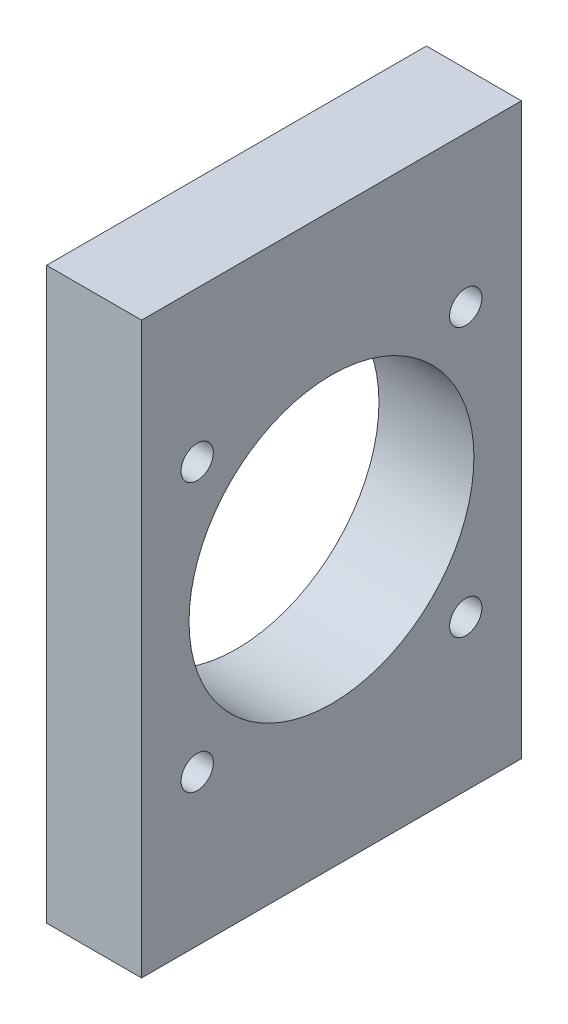
ISO-10303-21;
HEADER;
FILE_DESCRIPTION(('STEP AP214'),'2;1');
FILE_NAME('part.step','',(''),(''),'','','');
FILE_SCHEMA(('AUTOMOTIVE_DESIGN { 1 0 10303 214 1 1 1 1 }'));
ENDSEC;
DATA;
#1=APPLICATION_CONTEXT('core data for automotive mechanical design processes');
#2=APPLICATION_PROTOCOL_DEFINITION('international standard','automotive_design',2000,#1);
#3=PRODUCT_CONTEXT('',#1,'mechanical');
#4=PRODUCT('Part','Part','',(#3));
#5=PRODUCT_RELATED_PRODUCT_CATEGORY('part','',(#4));
#6=PRODUCT_DEFINITION_FORMATION('','',#4);
#7=PRODUCT_DEFINITION_CONTEXT('part definition',#1,'design');
#8=PRODUCT_DEFINITION('design','',#6,#7);
#9=PRODUCT_DEFINITION_SHAPE('','',#8);
#10=(LENGTH_UNIT() NAMED_UNIT(*) SI_UNIT(.MILLI.,.METRE.));
#11=(NAMED_UNIT(*) PLANE_ANGLE_UNIT() SI_UNIT($,.RADIAN.));
#12=(NAMED_UNIT(*) SI_UNIT($,.STERADIAN.) SOLID_ANGLE_UNIT());
#13=UNCERTAINTY_MEASURE_WITH_UNIT(LENGTH_MEASURE(1.E-05),#10,'distance_accuracy_value','');
#14=(GEOMETRIC_REPRESENTATION_CONTEXT(3) GLOBAL_UNCERTAINTY_ASSIGNED_CONTEXT((#13)) GLOBAL_UNIT_ASSIGNED_CONTEXT((#10,
#11,#12)) REPRESENTATION_CONTEXT('',''));
#15=CARTESIAN_POINT('',(0.,0.,0.));
#16=DIRECTION('',(0.,0.,1.));
#17=DIRECTION('',(1.,0.,0.));
#18=AXIS2_PLACEMENT_3D('',#15,#16,#17);
#19=CARTESIAN_POINT('',(10.,0.,0.));
#20=DIRECTION('',(0.,0.,-1.));
#21=DIRECTION('',(-1.,0.,0.));
#22=AXIS2_PLACEMENT_3D('',#19,#20,#21);
#23=PLANE('',#22);
#24=DIRECTION('',(0.,-1.,0.));
#25=VECTOR('',#24,1.);
#26=CARTESIAN_POINT('',(0.,0.,0.));
#27=LINE('',#26,#25);
#28=CARTESIAN_POINT('',(0.,60.,0.));
#29=VERTEX_POINT('',#28);
#30=CARTESIAN_POINT('',(0.,0.,0.));
#31=VERTEX_POINT('',#30);
#32=EDGE_CURVE('E112',#29,#31,#27,.T.);
#33=ORIENTED_EDGE('',*,*,#32,.T.);
#34=DIRECTION('',(-1.,0.,0.));
#35=VECTOR('',#34,1.);
#36=CARTESIAN_POINT('',(10.,0.,0.));
#37=LINE('',#36,#35);
#38=CARTESIAN_POINT('',(10.,0.,0.));
#39=VERTEX_POINT('',#38);
#40=EDGE_CURVE('E11',#39,#31,#37,.T.);
#41=ORIENTED_EDGE('',*,*,#40,.F.);
#42=DIRECTION('',(0.,-1.,0.));
#43=VECTOR('',#42,1.);
#44=CARTESIAN_POINT('',(10.,0.,0.));
#45=LINE('',#44,#43);
#46=CARTESIAN_POINT('',(10.,60.,0.));
#47=VERTEX_POINT('',#46);
#48=EDGE_CURVE('E96',#47,#39,#45,.T.);
#49=ORIENTED_EDGE('',*,*,#48,.F.);
#50=DIRECTION('',(-1.,0.,0.));
#51=VECTOR('',#50,1.);
#52=CARTESIAN_POINT('',(10.,60.,0.));
#53=LINE('',#52,#51);
#54=EDGE_CURVE('E108',#47,#29,#53,.T.);
#55=ORIENTED_EDGE('',*,*,#54,.T.);
#56=EDGE_LOOP('',(#33,#41,#49,#55));
#57=FACE_BOUND('',#56,.T.);
#58=ADVANCED_FACE('F44',(#57),#23,.F.);
#59=CARTESIAN_POINT('',(10.,0.,0.));
#60=DIRECTION('',(0.,1.,0.));
#61=DIRECTION('',(0.,0.,1.));
#62=AXIS2_PLACEMENT_3D('',#59,#60,#61);
#63=PLANE('',#62);
#64=DIRECTION('',(0.,0.,-1.));
#65=VECTOR('',#64,1.);
#66=CARTESIAN_POINT('',(0.,0.,0.));
#67=LINE('',#66,#65);
#68=CARTESIAN_POINT('',(0.,0.,-40.));
#69=VERTEX_POINT('',#68);
#70=EDGE_CURVE('E101',#31,#69,#67,.T.);
#71=ORIENTED_EDGE('',*,*,#70,.T.);
#72=DIRECTION('',(-1.,0.,0.));
#73=VECTOR('',#72,1.);
#74=CARTESIAN_POINT('',(10.,0.,-40.));
#75=LINE('',#74,#73);
#76=CARTESIAN_POINT('',(10.,0.,-40.));
#77=VERTEX_POINT('',#76);
#78=EDGE_CURVE('E53',#77,#69,#75,.T.);
#79=ORIENTED_EDGE('',*,*,#78,.F.);
#80=DIRECTION('',(0.,0.,-1.));
#81=VECTOR('',#80,1.);
#82=CARTESIAN_POINT('',(10.,0.,0.));
#83=LINE('',#82,#81);
#84=EDGE_CURVE('E91',#39,#77,#83,.T.);
#85=ORIENTED_EDGE('',*,*,#84,.F.);
#86=ORIENTED_EDGE('',*,*,#40,.T.);
#87=EDGE_LOOP('',(#71,#79,#85,#86));
#88=FACE_BOUND('',#87,.T.);
#89=ADVANCED_FACE('F100',(#88),#63,.F.);
#90=CARTESIAN_POINT('',(10.,0.,-40.));
#91=DIRECTION('',(0.,0.,1.));
#92=DIRECTION('',(1.,0.,0.));
#93=AXIS2_PLACEMENT_3D('',#90,#91,#92);
#94=PLANE('',#93);
#95=DIRECTION('',(0.,1.,0.));
#96=VECTOR('',#95,1.);
#97=CARTESIAN_POINT('',(0.,0.,-40.));
#98=LINE('',#97,#96);
#99=CARTESIAN_POINT('',(0.,60.,-40.));
#100=VERTEX_POINT('',#99);
#101=EDGE_CURVE('E78',#69,#100,#98,.T.);
#102=ORIENTED_EDGE('',*,*,#101,.T.);
#103=DIRECTION('',(-1.,0.,0.));
#104=VECTOR('',#103,1.);
#105=CARTESIAN_POINT('',(10.,60.,-40.));
#106=LINE('',#105,#104);
#107=CARTESIAN_POINT('',(10.,60.,-40.));
#108=VERTEX_POINT('',#107);
#109=EDGE_CURVE('E103',#108,#100,#106,.T.);
#110=ORIENTED_EDGE('',*,*,#109,.F.);
#111=DIRECTION('',(0.,1.,0.));
#112=VECTOR('',#111,1.);
#113=CARTESIAN_POINT('',(10.,0.,-40.));
#114=LINE('',#113,#112);
#115=EDGE_CURVE('E94',#77,#108,#114,.T.);
#116=ORIENTED_EDGE('',*,*,#115,.F.);
#117=ORIENTED_EDGE('',*,*,#78,.T.);
#118=EDGE_LOOP('',(#102,#110,#116,#117));
#119=FACE_BOUND('',#118,.T.);
#120=ADVANCED_FACE('F104',(#119),#94,.F.);
#121=CARTESIAN_POINT('',(10.,60.,0.));
#122=DIRECTION('',(0.,-1.,0.));
#123=DIRECTION('',(0.,0.,-1.));
#124=AXIS2_PLACEMENT_3D('',#121,#122,#123);
#125=PLANE('',#124);
#126=DIRECTION('',(0.,0.,1.));
#127=VECTOR('',#126,1.);
#128=CARTESIAN_POINT('',(0.,60.,0.));
#129=LINE('',#128,#127);
#130=EDGE_CURVE('E84',#100,#29,#129,.T.);
#131=ORIENTED_EDGE('',*,*,#130,.T.);
#132=ORIENTED_EDGE('',*,*,#54,.F.);
#133=DIRECTION('',(0.,0.,1.));
#134=VECTOR('',#133,1.);
#135=CARTESIAN_POINT('',(10.,60.,0.));
#136=LINE('',#135,#134);
#137=EDGE_CURVE('E61',#108,#47,#136,.T.);
#138=ORIENTED_EDGE('',*,*,#137,.F.);
#139=ORIENTED_EDGE('',*,*,#109,.T.);
#140=EDGE_LOOP('',(#131,#132,#138,#139));
#141=FACE_BOUND('',#140,.T.);
#142=ADVANCED_FACE('F126',(#141),#125,.F.);
#143=CARTESIAN_POINT('',(10.,0.,0.));
#144=DIRECTION('',(-1.,0.,0.));
#145=DIRECTION('',(0.,0.,1.));
#146=AXIS2_PLACEMENT_3D('',#143,#144,#145);
#147=PLANE('',#146);
#148=CARTESIAN_POINT('',(10.,30.,-20.));
#149=DIRECTION('',(-1.,0.,0.));
#150=DIRECTION('',(0.,0.,1.));
#151=AXIS2_PLACEMENT_3D('',#148,#149,#150);
#152=CIRCLE('',#151,15.);
#153=CARTESIAN_POINT('',(10.,30.,-5.));
#154=VERTEX_POINT('',#153);
#155=EDGE_CURVE('E196',#154,#154,#152,.T.);
#156=ORIENTED_EDGE('',*,*,#155,.T.);
#157=EDGE_LOOP('',(#156));
#158=FACE_BOUND('',#157,.T.);
#159=CARTESIAN_POINT('',(10.,44.1421356237309,-5.85786437626904));
#160=DIRECTION('',(-1.,0.,0.));
#161=DIRECTION('',(0.,0.,1.));
#162=AXIS2_PLACEMENT_3D('',#159,#160,#161);
#163=CIRCLE('',#162,1.7);
#164=CARTESIAN_POINT('',(10.,44.1421356237309,-4.15786437626904));
#165=VERTEX_POINT('',#164);
#166=EDGE_CURVE('E180',#165,#165,#163,.T.);
#167=ORIENTED_EDGE('',*,*,#166,.T.);
#168=EDGE_LOOP('',(#167));
#169=FACE_BOUND('',#168,.T.);
#170=CARTESIAN_POINT('',(10.,44.142135623731,-34.1421356237309));
#171=DIRECTION('',(-1.,0.,0.));
#172=DIRECTION('',(0.,0.,1.));
#173=AXIS2_PLACEMENT_3D('',#170,#171,#172);
#174=CIRCLE('',#173,1.7);
#175=CARTESIAN_POINT('',(10.,44.142135623731,-32.4421356237309));
#176=VERTEX_POINT('',#175);
#177=EDGE_CURVE('E164',#176,#176,#174,.T.);
#178=ORIENTED_EDGE('',*,*,#177,.T.);
#179=EDGE_LOOP('',(#178));
#180=FACE_BOUND('',#179,.T.);
#181=CARTESIAN_POINT('',(10.,15.8578643762691,-34.142135623731));
#182=DIRECTION('',(-1.,0.,0.));
#183=DIRECTION('',(0.,0.,1.));
#184=AXIS2_PLACEMENT_3D('',#181,#182,#183);
#185=CIRCLE('',#184,1.7);
#186=CARTESIAN_POINT('',(10.,15.8578643762691,-32.442135623731));
#187=VERTEX_POINT('',#186);
#188=EDGE_CURVE('E148',#187,#187,#185,.T.);
#189=ORIENTED_EDGE('',*,*,#188,.T.);
#190=EDGE_LOOP('',(#189));
#191=FACE_BOUND('',#190,.T.);
#192=CARTESIAN_POINT('',(10.,15.8578643762691,-5.85786437626905));
#193=DIRECTION('',(-1.,0.,0.));
#194=DIRECTION('',(0.,0.,1.));
#195=AXIS2_PLACEMENT_3D('',#192,#193,#194);
#196=CIRCLE('',#195,1.7);
#197=CARTESIAN_POINT('',(10.,15.8578643762691,-4.15786437626905));
#198=VERTEX_POINT('',#197);
#199=EDGE_CURVE('E116',#198,#198,#196,.T.);
#200=ORIENTED_EDGE('',*,*,#199,.T.);
#201=EDGE_LOOP('',(#200));
#202=FACE_BOUND('',#201,.T.);
#203=ORIENTED_EDGE('',*,*,#48,.T.);
#204=ORIENTED_EDGE('',*,*,#84,.T.);
#205=ORIENTED_EDGE('',*,*,#115,.T.);
#206=ORIENTED_EDGE('',*,*,#137,.T.);
#207=EDGE_LOOP('',(#203,#204,#205,#206));
#208=FACE_BOUND('',#207,.T.);
#209=ADVANCED_FACE('F92',(#158,#169,#180,#191,#202,#208),#147,.F.);
#210=CARTESIAN_POINT('',(0.,0.,0.));
#211=DIRECTION('',(-1.,0.,0.));
#212=DIRECTION('',(0.,0.,1.));
#213=AXIS2_PLACEMENT_3D('',#210,#211,#212);
#214=PLANE('',#213);
#215=CARTESIAN_POINT('',(0.,30.,-20.));
#216=DIRECTION('',(-1.,0.,0.));
#217=DIRECTION('',(0.,0.,1.));
#218=AXIS2_PLACEMENT_3D('',#215,#216,#217);
#219=CIRCLE('',#218,15.);
#220=CARTESIAN_POINT('',(0.,30.,-5.));
#221=VERTEX_POINT('',#220);
#222=EDGE_CURVE('E197',#221,#221,#219,.T.);
#223=ORIENTED_EDGE('',*,*,#222,.F.);
#224=EDGE_LOOP('',(#223));
#225=FACE_BOUND('',#224,.T.);
#226=CARTESIAN_POINT('',(0.,44.1421356237309,-5.85786437626904));
#227=DIRECTION('',(-1.,0.,0.));
#228=DIRECTION('',(0.,0.,1.));
#229=AXIS2_PLACEMENT_3D('',#226,#227,#228);
#230=CIRCLE('',#229,3.25);
#231=CARTESIAN_POINT('',(0.,44.1421356237309,-2.60786437626904));
#232=VERTEX_POINT('',#231);
#233=EDGE_CURVE('E192',#232,#232,#230,.T.);
#234=ORIENTED_EDGE('',*,*,#233,.F.);
#235=EDGE_LOOP('',(#234));
#236=FACE_BOUND('',#235,.T.);
#237=CARTESIAN_POINT('',(0.,44.142135623731,-34.1421356237309));
#238=DIRECTION('',(-1.,0.,0.));
#239=DIRECTION('',(0.,0.,1.));
#240=AXIS2_PLACEMENT_3D('',#237,#238,#239);
#241=CIRCLE('',#240,3.25);
#242=CARTESIAN_POINT('',(0.,44.142135623731,-30.8921356237309));
#243=VERTEX_POINT('',#242);
#244=EDGE_CURVE('E176',#243,#243,#241,.T.);
#245=ORIENTED_EDGE('',*,*,#244,.F.);
#246=EDGE_LOOP('',(#245));
#247=FACE_BOUND('',#246,.T.);
#248=CARTESIAN_POINT('',(0.,15.8578643762691,-34.142135623731));
#249=DIRECTION('',(-1.,0.,0.));
#250=DIRECTION('',(0.,0.,1.));
#251=AXIS2_PLACEMENT_3D('',#248,#249,#250);
#252=CIRCLE('',#251,3.25);
#253=CARTESIAN_POINT('',(0.,15.8578643762691,-30.892135623731));
#254=VERTEX_POINT('',#253);
#255=EDGE_CURVE('E160',#254,#254,#252,.T.);
#256=ORIENTED_EDGE('',*,*,#255,.F.);
#257=EDGE_LOOP('',(#256));
#258=FACE_BOUND('',#257,.T.);
#259=CARTESIAN_POINT('',(0.,15.8578643762691,-5.85786437626905));
#260=DIRECTION('',(-1.,0.,0.));
#261=DIRECTION('',(0.,0.,1.));
#262=AXIS2_PLACEMENT_3D('',#259,#260,#261);
#263=CIRCLE('',#262,3.25);
#264=CARTESIAN_POINT('',(0.,15.8578643762691,-2.60786437626905));
#265=VERTEX_POINT('',#264);
#266=EDGE_CURVE('E144',#265,#265,#263,.T.);
#267=ORIENTED_EDGE('',*,*,#266,.F.);
#268=EDGE_LOOP('',(#267));
#269=FACE_BOUND('',#268,.T.);
#270=ORIENTED_EDGE('',*,*,#32,.F.);
#271=ORIENTED_EDGE('',*,*,#130,.F.);
#272=ORIENTED_EDGE('',*,*,#101,.F.);
#273=ORIENTED_EDGE('',*,*,#70,.F.);
#274=EDGE_LOOP('',(#270,#271,#272,#273));
#275=FACE_BOUND('',#274,.T.);
#276=ADVANCED_FACE('F129',(#225,#236,#247,#258,#269,#275),#214,.T.);
#277=CARTESIAN_POINT('',(0.,15.8578643762691,-5.85786437626905));
#278=DIRECTION('',(-1.,0.,0.));
#279=DIRECTION('',(0.,0.,1.));
#280=AXIS2_PLACEMENT_3D('',#277,#278,#279);
#281=CYLINDRICAL_SURFACE('',#280,1.7);
#282=ORIENTED_EDGE('',*,*,#199,.F.);
#283=EDGE_LOOP('',(#282));
#284=FACE_BOUND('',#283,.T.);
#285=CARTESIAN_POINT('',(2.4,15.8578643762691,-5.85786437626905));
#286=DIRECTION('',(-1.,0.,0.));
#287=DIRECTION('',(0.,0.,1.));
#288=AXIS2_PLACEMENT_3D('',#285,#286,#287);
#289=CIRCLE('',#288,1.7);
#290=CARTESIAN_POINT('',(2.4,15.8578643762691,-4.15786437626905));
#291=VERTEX_POINT('',#290);
#292=EDGE_CURVE('E136',#291,#291,#289,.T.);
#293=ORIENTED_EDGE('',*,*,#292,.T.);
#294=EDGE_LOOP('',(#293));
#295=FACE_BOUND('',#294,.T.);
#296=ADVANCED_FACE('F216',(#284,#295),#281,.F.);
#297=CARTESIAN_POINT('',(2.4,17.5578643762691,-5.85786437626905));
#298=DIRECTION('',(1.,0.,0.));
#299=DIRECTION('',(0.,0.,-1.));
#300=AXIS2_PLACEMENT_3D('',#297,#298,#299);
#301=PLANE('',#300);
#302=ORIENTED_EDGE('',*,*,#292,.F.);
#303=EDGE_LOOP('',(#302));
#304=FACE_BOUND('',#303,.T.);
#305=CARTESIAN_POINT('',(2.4,15.8578643762691,-5.85786437626905));
#306=DIRECTION('',(-1.,0.,0.));
#307=DIRECTION('',(0.,0.,1.));
#308=AXIS2_PLACEMENT_3D('',#305,#306,#307);
#309=CIRCLE('',#308,3.25);
#310=CARTESIAN_POINT('',(2.4,15.8578643762691,-2.60786437626905));
#311=VERTEX_POINT('',#310);
#312=EDGE_CURVE('E140',#311,#311,#309,.T.);
#313=ORIENTED_EDGE('',*,*,#312,.T.);
#314=EDGE_LOOP('',(#313));
#315=FACE_BOUND('',#314,.T.);
#316=ADVANCED_FACE('F229',(#304,#315),#301,.F.);
#317=CARTESIAN_POINT('',(0.,15.8578643762691,-5.85786437626905));
#318=DIRECTION('',(-1.,0.,0.));
#319=DIRECTION('',(0.,0.,1.));
#320=AXIS2_PLACEMENT_3D('',#317,#318,#319);
#321=CYLINDRICAL_SURFACE('',#320,3.25);
#322=ORIENTED_EDGE('',*,*,#312,.F.);
#323=EDGE_LOOP('',(#322));
#324=FACE_BOUND('',#323,.T.);
#325=ORIENTED_EDGE('',*,*,#266,.T.);
#326=EDGE_LOOP('',(#325));
#327=FACE_BOUND('',#326,.T.);
#328=ADVANCED_FACE('F226',(#324,#327),#321,.F.);
#329=CARTESIAN_POINT('',(0.,15.8578643762691,-34.142135623731));
#330=DIRECTION('',(-1.,0.,0.));
#331=DIRECTION('',(0.,0.,1.));
#332=AXIS2_PLACEMENT_3D('',#329,#330,#331);
#333=CYLINDRICAL_SURFACE('',#332,1.7);
#334=ORIENTED_EDGE('',*,*,#188,.F.);
#335=EDGE_LOOP('',(#334));
#336=FACE_BOUND('',#335,.T.);
#337=CARTESIAN_POINT('',(2.4,15.8578643762691,-34.142135623731));
#338=DIRECTION('',(-1.,0.,0.));
#339=DIRECTION('',(0.,0.,1.));
#340=AXIS2_PLACEMENT_3D('',#337,#338,#339);
#341=CIRCLE('',#340,1.7);
#342=CARTESIAN_POINT('',(2.4,15.8578643762691,-32.442135623731));
#343=VERTEX_POINT('',#342);
#344=EDGE_CURVE('E152',#343,#343,#341,.T.);
#345=ORIENTED_EDGE('',*,*,#344,.T.);
#346=EDGE_LOOP('',(#345));
#347=FACE_BOUND('',#346,.T.);
#348=ADVANCED_FACE('F228',(#336,#347),#333,.F.);
#349=CARTESIAN_POINT('',(2.4,17.5578643762691,-34.142135623731));
#350=DIRECTION('',(1.,0.,0.));
#351=DIRECTION('',(0.,0.,-1.));
#352=AXIS2_PLACEMENT_3D('',#349,#350,#351);
#353=PLANE('',#352);
#354=ORIENTED_EDGE('',*,*,#344,.F.);
#355=EDGE_LOOP('',(#354));
#356=FACE_BOUND('',#355,.T.);
#357=CARTESIAN_POINT('',(2.4,15.8578643762691,-34.142135623731));
#358=DIRECTION('',(-1.,0.,0.));
#359=DIRECTION('',(0.,0.,1.));
#360=AXIS2_PLACEMENT_3D('',#357,#358,#359);
#361=CIRCLE('',#360,3.25);
#362=CARTESIAN_POINT('',(2.4,15.8578643762691,-30.892135623731));
#363=VERTEX_POINT('',#362);
#364=EDGE_CURVE('E156',#363,#363,#361,.T.);
#365=ORIENTED_EDGE('',*,*,#364,.T.);
#366=EDGE_LOOP('',(#365));
#367=FACE_BOUND('',#366,.T.);
#368=ADVANCED_FACE('F236',(#356,#367),#353,.F.);
#369=CARTESIAN_POINT('',(0.,15.8578643762691,-34.142135623731));
#370=DIRECTION('',(-1.,0.,0.));
#371=DIRECTION('',(0.,0.,1.));
#372=AXIS2_PLACEMENT_3D('',#369,#370,#371);
#373=CYLINDRICAL_SURFACE('',#372,3.25);
#374=ORIENTED_EDGE('',*,*,#364,.F.);
#375=EDGE_LOOP('',(#374));
#376=FACE_BOUND('',#375,.T.);
#377=ORIENTED_EDGE('',*,*,#255,.T.);
#378=EDGE_LOOP('',(#377));
#379=FACE_BOUND('',#378,.T.);
#380=ADVANCED_FACE('F292',(#376,#379),#373,.F.);
#381=CARTESIAN_POINT('',(0.,44.142135623731,-34.1421356237309));
#382=DIRECTION('',(-1.,0.,0.));
#383=DIRECTION('',(0.,0.,1.));
#384=AXIS2_PLACEMENT_3D('',#381,#382,#383);
#385=CYLINDRICAL_SURFACE('',#384,1.7);
#386=ORIENTED_EDGE('',*,*,#177,.F.);
#387=EDGE_LOOP('',(#386));
#388=FACE_BOUND('',#387,.T.);
#389=CARTESIAN_POINT('',(2.4,44.142135623731,-34.1421356237309));
#390=DIRECTION('',(-1.,0.,0.));
#391=DIRECTION('',(0.,0.,1.));
#392=AXIS2_PLACEMENT_3D('',#389,#390,#391);
#393=CIRCLE('',#392,1.7);
#394=CARTESIAN_POINT('',(2.4,44.142135623731,-32.4421356237309));
#395=VERTEX_POINT('',#394);
#396=EDGE_CURVE('E168',#395,#395,#393,.T.);
#397=ORIENTED_EDGE('',*,*,#396,.T.);
#398=EDGE_LOOP('',(#397));
#399=FACE_BOUND('',#398,.T.);
#400=ADVANCED_FACE('F302',(#388,#399),#385,.F.);
#401=CARTESIAN_POINT('',(2.4,45.8421356237309,-34.1421356237309));
#402=DIRECTION('',(1.,0.,0.));
#403=DIRECTION('',(0.,0.,-1.));
#404=AXIS2_PLACEMENT_3D('',#401,#402,#403);
#405=PLANE('',#404);
#406=ORIENTED_EDGE('',*,*,#396,.F.);
#407=EDGE_LOOP('',(#406));
#408=FACE_BOUND('',#407,.T.);
#409=CARTESIAN_POINT('',(2.4,44.142135623731,-34.1421356237309));
#410=DIRECTION('',(-1.,0.,0.));
#411=DIRECTION('',(0.,0.,1.));
#412=AXIS2_PLACEMENT_3D('',#409,#410,#411);
#413=CIRCLE('',#412,3.25);
#414=CARTESIAN_POINT('',(2.4,44.142135623731,-30.8921356237309));
#415=VERTEX_POINT('',#414);
#416=EDGE_CURVE('E172',#415,#415,#413,.T.);
#417=ORIENTED_EDGE('',*,*,#416,.T.);
#418=EDGE_LOOP('',(#417));
#419=FACE_BOUND('',#418,.T.);
#420=ADVANCED_FACE('F312',(#408,#419),#405,.F.);
#421=CARTESIAN_POINT('',(0.,44.142135623731,-34.1421356237309));
#422=DIRECTION('',(-1.,0.,0.));
#423=DIRECTION('',(0.,0.,1.));
#424=AXIS2_PLACEMENT_3D('',#421,#422,#423);
#425=CYLINDRICAL_SURFACE('',#424,3.25);
#426=ORIENTED_EDGE('',*,*,#416,.F.);
#427=EDGE_LOOP('',(#426));
#428=FACE_BOUND('',#427,.T.);
#429=ORIENTED_EDGE('',*,*,#244,.T.);
#430=EDGE_LOOP('',(#429));
#431=FACE_BOUND('',#430,.T.);
#432=ADVANCED_FACE('F322',(#428,#431),#425,.F.);
#433=CARTESIAN_POINT('',(0.,44.1421356237309,-5.85786437626904));
#434=DIRECTION('',(-1.,0.,0.));
#435=DIRECTION('',(0.,0.,1.));
#436=AXIS2_PLACEMENT_3D('',#433,#434,#435);
#437=CYLINDRICAL_SURFACE('',#436,1.7);
#438=ORIENTED_EDGE('',*,*,#166,.F.);
#439=EDGE_LOOP('',(#438));
#440=FACE_BOUND('',#439,.T.);
#441=CARTESIAN_POINT('',(2.4,44.1421356237309,-5.85786437626904));
#442=DIRECTION('',(-1.,0.,0.));
#443=DIRECTION('',(0.,0.,1.));
#444=AXIS2_PLACEMENT_3D('',#441,#442,#443);
#445=CIRCLE('',#444,1.7);
#446=CARTESIAN_POINT('',(2.4,44.1421356237309,-4.15786437626904));
#447=VERTEX_POINT('',#446);
#448=EDGE_CURVE('E184',#447,#447,#445,.T.);
#449=ORIENTED_EDGE('',*,*,#448,.T.);
#450=EDGE_LOOP('',(#449));
#451=FACE_BOUND('',#450,.T.);
#452=ADVANCED_FACE('F332',(#440,#451),#437,.F.);
#453=CARTESIAN_POINT('',(2.4,45.8421356237309,-5.85786437626904));
#454=DIRECTION('',(1.,0.,0.));
#455=DIRECTION('',(0.,0.,-1.));
#456=AXIS2_PLACEMENT_3D('',#453,#454,#455);
#457=PLANE('',#456);
#458=ORIENTED_EDGE('',*,*,#448,.F.);
#459=EDGE_LOOP('',(#458));
#460=FACE_BOUND('',#459,.T.);
#461=CARTESIAN_POINT('',(2.4,44.1421356237309,-5.85786437626904));
#462=DIRECTION('',(-1.,0.,0.));
#463=DIRECTION('',(0.,0.,1.));
#464=AXIS2_PLACEMENT_3D('',#461,#462,#463);
#465=CIRCLE('',#464,3.25);
#466=CARTESIAN_POINT('',(2.4,44.1421356237309,-2.60786437626904));
#467=VERTEX_POINT('',#466);
#468=EDGE_CURVE('E188',#467,#467,#465,.T.);
#469=ORIENTED_EDGE('',*,*,#468,.T.);
#470=EDGE_LOOP('',(#469));
#471=FACE_BOUND('',#470,.T.);
#472=ADVANCED_FACE('F342',(#460,#471),#457,.F.);
#473=CARTESIAN_POINT('',(0.,44.1421356237309,-5.85786437626904));
#474=DIRECTION('',(-1.,0.,0.));
#475=DIRECTION('',(0.,0.,1.));
#476=AXIS2_PLACEMENT_3D('',#473,#474,#475);
#477=CYLINDRICAL_SURFACE('',#476,3.25);
#478=ORIENTED_EDGE('',*,*,#468,.F.);
#479=EDGE_LOOP('',(#478));
#480=FACE_BOUND('',#479,.T.);
#481=ORIENTED_EDGE('',*,*,#233,.T.);
#482=EDGE_LOOP('',(#481));
#483=FACE_BOUND('',#482,.T.);
#484=ADVANCED_FACE('F210',(#480,#483),#477,.F.);
#485=CARTESIAN_POINT('',(10.,30.,-20.));
#486=DIRECTION('',(-1.,0.,0.));
#487=DIRECTION('',(0.,0.,1.));
#488=AXIS2_PLACEMENT_3D('',#485,#486,#487);
#489=CYLINDRICAL_SURFACE('',#488,15.);
#490=ORIENTED_EDGE('',*,*,#155,.F.);
#491=EDGE_LOOP('',(#490));
#492=FACE_BOUND('',#491,.T.);
#493=ORIENTED_EDGE('',*,*,#222,.T.);
#494=EDGE_LOOP('',(#493));
#495=FACE_BOUND('',#494,.T.);
#496=ADVANCED_FACE('F207',(#492,#495),#489,.F.);
#497=CLOSED_SHELL('',(#58,#89,#120,#142,#209,#276,#296,#316,#328,#348,#368,#380,#400,#420,#432,
#452,#472,#484,#496));
#498=MANIFOLD_SOLID_BREP('B2',#497);
#499=ADVANCED_BREP_SHAPE_REPRESENTATION('',(#18,#498),#14);
#500=SHAPE_DEFINITION_REPRESENTATION(#9,#499);
ENDSEC;
END-ISO-10303-21;
